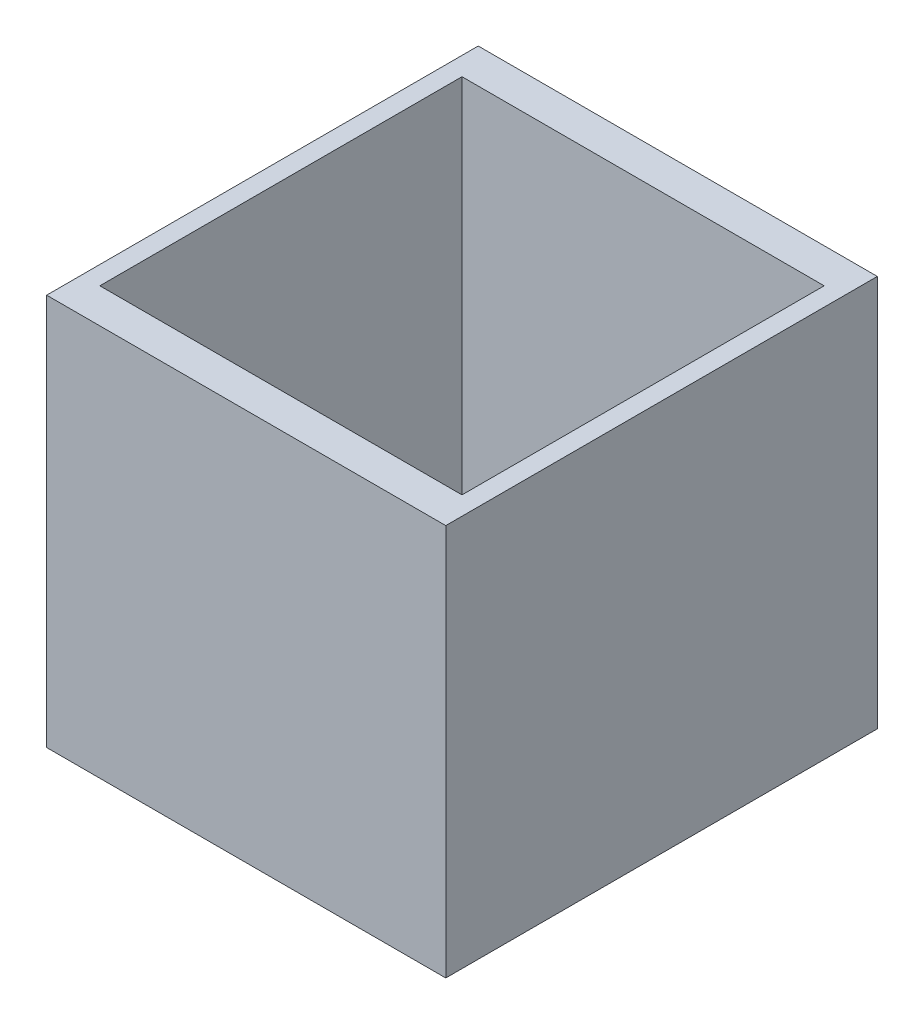
ISO-10303-21;
HEADER;
FILE_DESCRIPTION(('STEP AP214'),'2;1');
FILE_NAME('part.step','',(''),(''),'','','');
FILE_SCHEMA(('AUTOMOTIVE_DESIGN { 1 0 10303 214 1 1 1 1 }'));
ENDSEC;
DATA;
#1=APPLICATION_CONTEXT('core data for automotive mechanical design processes');
#2=APPLICATION_PROTOCOL_DEFINITION('international standard','automotive_design',2000,#1);
#3=PRODUCT_CONTEXT('',#1,'mechanical');
#4=PRODUCT('Part','Part','',(#3));
#5=PRODUCT_RELATED_PRODUCT_CATEGORY('part','',(#4));
#6=PRODUCT_DEFINITION_FORMATION('','',#4);
#7=PRODUCT_DEFINITION_CONTEXT('part definition',#1,'design');
#8=PRODUCT_DEFINITION('design','',#6,#7);
#9=PRODUCT_DEFINITION_SHAPE('','',#8);
#10=(LENGTH_UNIT() NAMED_UNIT(*) SI_UNIT(.MILLI.,.METRE.));
#11=(NAMED_UNIT(*) PLANE_ANGLE_UNIT() SI_UNIT($,.RADIAN.));
#12=(NAMED_UNIT(*) SI_UNIT($,.STERADIAN.) SOLID_ANGLE_UNIT());
#13=UNCERTAINTY_MEASURE_WITH_UNIT(LENGTH_MEASURE(1.E-05),#10,'distance_accuracy_value','');
#14=(GEOMETRIC_REPRESENTATION_CONTEXT(3) GLOBAL_UNCERTAINTY_ASSIGNED_CONTEXT((#13)) GLOBAL_UNIT_ASSIGNED_CONTEXT((#10,
#11,#12)) REPRESENTATION_CONTEXT('',''));
#15=CARTESIAN_POINT('',(0.,0.,0.));
#16=DIRECTION('',(0.,0.,1.));
#17=DIRECTION('',(1.,0.,0.));
#18=AXIS2_PLACEMENT_3D('',#15,#16,#17);
#19=CARTESIAN_POINT('',(0.,23.06,0.));
#20=DIRECTION('',(0.,1.,0.));
#21=DIRECTION('',(0.,0.,1.));
#22=AXIS2_PLACEMENT_3D('',#19,#20,#21);
#23=PLANE('',#22);
#24=DIRECTION('',(0.,0.,-1.));
#25=VECTOR('',#24,1.);
#26=CARTESIAN_POINT('',(11.745,23.06,-12.7));
#27=LINE('',#26,#25);
#28=CARTESIAN_POINT('',(11.745,23.06,12.7));
#29=VERTEX_POINT('',#28);
#30=CARTESIAN_POINT('',(11.745,23.06,-12.7));
#31=VERTEX_POINT('',#30);
#32=EDGE_CURVE('E134',#29,#31,#27,.T.);
#33=ORIENTED_EDGE('',*,*,#32,.T.);
#34=DIRECTION('',(-1.,0.,0.));
#35=VECTOR('',#34,1.);
#36=CARTESIAN_POINT('',(-11.745,23.06,-12.7));
#37=LINE('',#36,#35);
#38=CARTESIAN_POINT('',(-11.745,23.06,-12.7));
#39=VERTEX_POINT('',#38);
#40=EDGE_CURVE('E137',#31,#39,#37,.T.);
#41=ORIENTED_EDGE('',*,*,#40,.T.);
#42=DIRECTION('',(0.,0.,1.));
#43=VECTOR('',#42,1.);
#44=CARTESIAN_POINT('',(-11.745,23.06,-12.7));
#45=LINE('',#44,#43);
#46=CARTESIAN_POINT('',(-11.745,23.06,12.7));
#47=VERTEX_POINT('',#46);
#48=EDGE_CURVE('E140',#39,#47,#45,.T.);
#49=ORIENTED_EDGE('',*,*,#48,.T.);
#50=DIRECTION('',(1.,0.,0.));
#51=VECTOR('',#50,1.);
#52=CARTESIAN_POINT('',(-11.745,23.06,12.7));
#53=LINE('',#52,#51);
#54=EDGE_CURVE('E142',#47,#29,#53,.T.);
#55=ORIENTED_EDGE('',*,*,#54,.T.);
#56=EDGE_LOOP('',(#33,#41,#49,#55));
#57=FACE_BOUND('',#56,.T.);
#58=DIRECTION('',(-1.,0.,0.));
#59=VECTOR('',#58,1.);
#60=CARTESIAN_POINT('',(-10.6575,23.06,-10.6575));
#61=LINE('',#60,#59);
#62=CARTESIAN_POINT('',(10.6575,23.06,-10.6575));
#63=VERTEX_POINT('',#62);
#64=CARTESIAN_POINT('',(-10.6575,23.06,-10.6575));
#65=VERTEX_POINT('',#64);
#66=EDGE_CURVE('E106',#63,#65,#61,.T.);
#67=ORIENTED_EDGE('',*,*,#66,.F.);
#68=DIRECTION('',(0.,0.,-1.));
#69=VECTOR('',#68,1.);
#70=CARTESIAN_POINT('',(10.6575,23.06,-10.6575));
#71=LINE('',#70,#69);
#72=CARTESIAN_POINT('',(10.6575,23.06,10.6575));
#73=VERTEX_POINT('',#72);
#74=EDGE_CURVE('E98',#73,#63,#71,.T.);
#75=ORIENTED_EDGE('',*,*,#74,.F.);
#76=DIRECTION('',(1.,0.,0.));
#77=VECTOR('',#76,1.);
#78=CARTESIAN_POINT('',(-10.6575,23.06,10.6575));
#79=LINE('',#78,#77);
#80=CARTESIAN_POINT('',(-10.6575,23.06,10.6575));
#81=VERTEX_POINT('',#80);
#82=EDGE_CURVE('E120',#81,#73,#79,.T.);
#83=ORIENTED_EDGE('',*,*,#82,.F.);
#84=DIRECTION('',(0.,0.,1.));
#85=VECTOR('',#84,1.);
#86=CARTESIAN_POINT('',(-10.6575,23.06,-10.6575));
#87=LINE('',#86,#85);
#88=EDGE_CURVE('E118',#65,#81,#87,.T.);
#89=ORIENTED_EDGE('',*,*,#88,.F.);
#90=EDGE_LOOP('',(#67,#75,#83,#89));
#91=FACE_BOUND('',#90,.T.);
#92=ADVANCED_FACE('F33',(#57,#91),#23,.T.);
#93=CARTESIAN_POINT('',(0.,0.,0.));
#94=DIRECTION('',(0.,1.,0.));
#95=DIRECTION('',(0.,0.,1.));
#96=AXIS2_PLACEMENT_3D('',#93,#94,#95);
#97=PLANE('',#96);
#98=DIRECTION('',(0.,0.,-1.));
#99=VECTOR('',#98,1.);
#100=CARTESIAN_POINT('',(11.745,0.,-12.7));
#101=LINE('',#100,#99);
#102=CARTESIAN_POINT('',(11.745,0.,12.7));
#103=VERTEX_POINT('',#102);
#104=CARTESIAN_POINT('',(11.745,0.,-12.7));
#105=VERTEX_POINT('',#104);
#106=EDGE_CURVE('E114',#103,#105,#101,.T.);
#107=ORIENTED_EDGE('',*,*,#106,.F.);
#108=DIRECTION('',(1.,0.,0.));
#109=VECTOR('',#108,1.);
#110=CARTESIAN_POINT('',(-11.745,0.,12.7));
#111=LINE('',#110,#109);
#112=CARTESIAN_POINT('',(-11.745,0.,12.7));
#113=VERTEX_POINT('',#112);
#114=EDGE_CURVE('E138',#113,#103,#111,.T.);
#115=ORIENTED_EDGE('',*,*,#114,.F.);
#116=DIRECTION('',(0.,0.,1.));
#117=VECTOR('',#116,1.);
#118=CARTESIAN_POINT('',(-11.745,0.,-12.7));
#119=LINE('',#118,#117);
#120=CARTESIAN_POINT('',(-11.745,0.,-12.7));
#121=VERTEX_POINT('',#120);
#122=EDGE_CURVE('E149',#121,#113,#119,.T.);
#123=ORIENTED_EDGE('',*,*,#122,.F.);
#124=DIRECTION('',(-1.,0.,0.));
#125=VECTOR('',#124,1.);
#126=CARTESIAN_POINT('',(-11.745,0.,-12.7));
#127=LINE('',#126,#125);
#128=EDGE_CURVE('E147',#105,#121,#127,.T.);
#129=ORIENTED_EDGE('',*,*,#128,.F.);
#130=EDGE_LOOP('',(#107,#115,#123,#129));
#131=FACE_BOUND('',#130,.T.);
#132=DIRECTION('',(0.,0.,-1.));
#133=VECTOR('',#132,1.);
#134=CARTESIAN_POINT('',(10.6575,0.,-10.6575));
#135=LINE('',#134,#133);
#136=CARTESIAN_POINT('',(10.6575,0.,10.6575));
#137=VERTEX_POINT('',#136);
#138=CARTESIAN_POINT('',(10.6575,0.,-10.6575));
#139=VERTEX_POINT('',#138);
#140=EDGE_CURVE('E56',#137,#139,#135,.T.);
#141=ORIENTED_EDGE('',*,*,#140,.T.);
#142=DIRECTION('',(-1.,0.,0.));
#143=VECTOR('',#142,1.);
#144=CARTESIAN_POINT('',(-10.6575,0.,-10.6575));
#145=LINE('',#144,#143);
#146=CARTESIAN_POINT('',(-10.6575,0.,-10.6575));
#147=VERTEX_POINT('',#146);
#148=EDGE_CURVE('E113',#139,#147,#145,.T.);
#149=ORIENTED_EDGE('',*,*,#148,.T.);
#150=DIRECTION('',(0.,0.,1.));
#151=VECTOR('',#150,1.);
#152=CARTESIAN_POINT('',(-10.6575,0.,-10.6575));
#153=LINE('',#152,#151);
#154=CARTESIAN_POINT('',(-10.6575,0.,10.6575));
#155=VERTEX_POINT('',#154);
#156=EDGE_CURVE('E126',#147,#155,#153,.T.);
#157=ORIENTED_EDGE('',*,*,#156,.T.);
#158=DIRECTION('',(1.,0.,0.));
#159=VECTOR('',#158,1.);
#160=CARTESIAN_POINT('',(-10.6575,0.,10.6575));
#161=LINE('',#160,#159);
#162=EDGE_CURVE('E107',#155,#137,#161,.T.);
#163=ORIENTED_EDGE('',*,*,#162,.T.);
#164=EDGE_LOOP('',(#141,#149,#157,#163));
#165=FACE_BOUND('',#164,.T.);
#166=ADVANCED_FACE('F167',(#131,#165),#97,.F.);
#167=CARTESIAN_POINT('',(11.745,23.06,-12.7));
#168=DIRECTION('',(-1.,0.,0.));
#169=DIRECTION('',(0.,0.,1.));
#170=AXIS2_PLACEMENT_3D('',#167,#168,#169);
#171=PLANE('',#170);
#172=ORIENTED_EDGE('',*,*,#106,.T.);
#173=DIRECTION('',(0.,-1.,0.));
#174=VECTOR('',#173,1.);
#175=CARTESIAN_POINT('',(11.745,23.06,-12.7));
#176=LINE('',#175,#174);
#177=EDGE_CURVE('E11',#31,#105,#176,.T.);
#178=ORIENTED_EDGE('',*,*,#177,.F.);
#179=ORIENTED_EDGE('',*,*,#32,.F.);
#180=DIRECTION('',(0.,-1.,0.));
#181=VECTOR('',#180,1.);
#182=CARTESIAN_POINT('',(11.745,23.06,12.7));
#183=LINE('',#182,#181);
#184=EDGE_CURVE('E144',#29,#103,#183,.T.);
#185=ORIENTED_EDGE('',*,*,#184,.T.);
#186=EDGE_LOOP('',(#172,#178,#179,#185));
#187=FACE_BOUND('',#186,.T.);
#188=ADVANCED_FACE('F35',(#187),#171,.F.);
#189=CARTESIAN_POINT('',(-11.745,23.06,-12.7));
#190=DIRECTION('',(0.,0.,1.));
#191=DIRECTION('',(1.,0.,0.));
#192=AXIS2_PLACEMENT_3D('',#189,#190,#191);
#193=PLANE('',#192);
#194=ORIENTED_EDGE('',*,*,#128,.T.);
#195=DIRECTION('',(0.,-1.,0.));
#196=VECTOR('',#195,1.);
#197=CARTESIAN_POINT('',(-11.745,23.06,-12.7));
#198=LINE('',#197,#196);
#199=EDGE_CURVE('E41',#39,#121,#198,.T.);
#200=ORIENTED_EDGE('',*,*,#199,.F.);
#201=ORIENTED_EDGE('',*,*,#40,.F.);
#202=ORIENTED_EDGE('',*,*,#177,.T.);
#203=EDGE_LOOP('',(#194,#200,#201,#202));
#204=FACE_BOUND('',#203,.T.);
#205=ADVANCED_FACE('F177',(#204),#193,.F.);
#206=CARTESIAN_POINT('',(-11.745,23.06,-12.7));
#207=DIRECTION('',(1.,0.,0.));
#208=DIRECTION('',(0.,0.,-1.));
#209=AXIS2_PLACEMENT_3D('',#206,#207,#208);
#210=PLANE('',#209);
#211=ORIENTED_EDGE('',*,*,#122,.T.);
#212=DIRECTION('',(0.,-1.,0.));
#213=VECTOR('',#212,1.);
#214=CARTESIAN_POINT('',(-11.745,23.06,12.7));
#215=LINE('',#214,#213);
#216=EDGE_CURVE('E154',#47,#113,#215,.T.);
#217=ORIENTED_EDGE('',*,*,#216,.F.);
#218=ORIENTED_EDGE('',*,*,#48,.F.);
#219=ORIENTED_EDGE('',*,*,#199,.T.);
#220=EDGE_LOOP('',(#211,#217,#218,#219));
#221=FACE_BOUND('',#220,.T.);
#222=ADVANCED_FACE('F161',(#221),#210,.F.);
#223=CARTESIAN_POINT('',(-11.745,23.06,12.7));
#224=DIRECTION('',(0.,0.,-1.));
#225=DIRECTION('',(-1.,0.,0.));
#226=AXIS2_PLACEMENT_3D('',#223,#224,#225);
#227=PLANE('',#226);
#228=ORIENTED_EDGE('',*,*,#114,.T.);
#229=ORIENTED_EDGE('',*,*,#184,.F.);
#230=ORIENTED_EDGE('',*,*,#54,.F.);
#231=ORIENTED_EDGE('',*,*,#216,.T.);
#232=EDGE_LOOP('',(#228,#229,#230,#231));
#233=FACE_BOUND('',#232,.T.);
#234=ADVANCED_FACE('F171',(#233),#227,.F.);
#235=CARTESIAN_POINT('',(10.6575,23.06,-10.6575));
#236=DIRECTION('',(-1.,0.,0.));
#237=DIRECTION('',(0.,0.,1.));
#238=AXIS2_PLACEMENT_3D('',#235,#236,#237);
#239=PLANE('',#238);
#240=ORIENTED_EDGE('',*,*,#140,.F.);
#241=DIRECTION('',(0.,-1.,0.));
#242=VECTOR('',#241,1.);
#243=CARTESIAN_POINT('',(10.6575,23.06,10.6575));
#244=LINE('',#243,#242);
#245=EDGE_CURVE('E102',#73,#137,#244,.T.);
#246=ORIENTED_EDGE('',*,*,#245,.F.);
#247=ORIENTED_EDGE('',*,*,#74,.T.);
#248=DIRECTION('',(0.,-1.,0.));
#249=VECTOR('',#248,1.);
#250=CARTESIAN_POINT('',(10.6575,23.06,-10.6575));
#251=LINE('',#250,#249);
#252=EDGE_CURVE('E101',#63,#139,#251,.T.);
#253=ORIENTED_EDGE('',*,*,#252,.T.);
#254=EDGE_LOOP('',(#240,#246,#247,#253));
#255=FACE_BOUND('',#254,.T.);
#256=ADVANCED_FACE('F100',(#255),#239,.T.);
#257=CARTESIAN_POINT('',(-10.6575,23.06,-10.6575));
#258=DIRECTION('',(0.,0.,1.));
#259=DIRECTION('',(1.,0.,0.));
#260=AXIS2_PLACEMENT_3D('',#257,#258,#259);
#261=PLANE('',#260);
#262=ORIENTED_EDGE('',*,*,#148,.F.);
#263=ORIENTED_EDGE('',*,*,#252,.F.);
#264=ORIENTED_EDGE('',*,*,#66,.T.);
#265=DIRECTION('',(0.,-1.,0.));
#266=VECTOR('',#265,1.);
#267=CARTESIAN_POINT('',(-10.6575,23.06,-10.6575));
#268=LINE('',#267,#266);
#269=EDGE_CURVE('E115',#65,#147,#268,.T.);
#270=ORIENTED_EDGE('',*,*,#269,.T.);
#271=EDGE_LOOP('',(#262,#263,#264,#270));
#272=FACE_BOUND('',#271,.T.);
#273=ADVANCED_FACE('F110',(#272),#261,.T.);
#274=CARTESIAN_POINT('',(-10.6575,23.06,-10.6575));
#275=DIRECTION('',(1.,0.,0.));
#276=DIRECTION('',(0.,0.,-1.));
#277=AXIS2_PLACEMENT_3D('',#274,#275,#276);
#278=PLANE('',#277);
#279=ORIENTED_EDGE('',*,*,#156,.F.);
#280=ORIENTED_EDGE('',*,*,#269,.F.);
#281=ORIENTED_EDGE('',*,*,#88,.T.);
#282=DIRECTION('',(0.,-1.,0.));
#283=VECTOR('',#282,1.);
#284=CARTESIAN_POINT('',(-10.6575,23.06,10.6575));
#285=LINE('',#284,#283);
#286=EDGE_CURVE('E48',#81,#155,#285,.T.);
#287=ORIENTED_EDGE('',*,*,#286,.T.);
#288=EDGE_LOOP('',(#279,#280,#281,#287));
#289=FACE_BOUND('',#288,.T.);
#290=ADVANCED_FACE('F200',(#289),#278,.T.);
#291=CARTESIAN_POINT('',(-10.6575,23.06,10.6575));
#292=DIRECTION('',(0.,0.,-1.));
#293=DIRECTION('',(-1.,0.,0.));
#294=AXIS2_PLACEMENT_3D('',#291,#292,#293);
#295=PLANE('',#294);
#296=ORIENTED_EDGE('',*,*,#162,.F.);
#297=ORIENTED_EDGE('',*,*,#286,.F.);
#298=ORIENTED_EDGE('',*,*,#82,.T.);
#299=ORIENTED_EDGE('',*,*,#245,.T.);
#300=EDGE_LOOP('',(#296,#297,#298,#299));
#301=FACE_BOUND('',#300,.T.);
#302=ADVANCED_FACE('F204',(#301),#295,.T.);
#303=CLOSED_SHELL('',(#92,#166,#188,#205,#222,#234,#256,#273,#290,#302));
#304=MANIFOLD_SOLID_BREP('B2',#303);
#305=ADVANCED_BREP_SHAPE_REPRESENTATION('',(#18,#304),#14);
#306=SHAPE_DEFINITION_REPRESENTATION(#9,#305);
ENDSEC;
END-ISO-10303-21;
